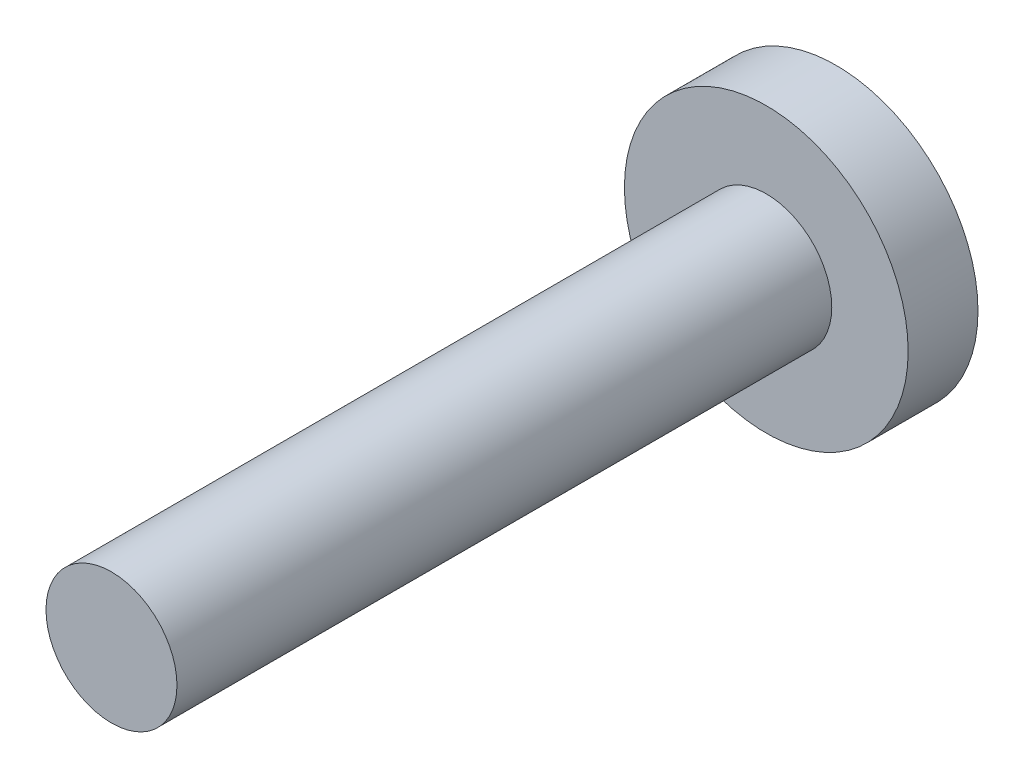
ISO-10303-21;
HEADER;
FILE_DESCRIPTION(('STEP AP214'),'2;1');
FILE_NAME('part.step','',(''),(''),'','','');
FILE_SCHEMA(('AUTOMOTIVE_DESIGN { 1 0 10303 214 1 1 1 1 }'));
ENDSEC;
DATA;
#1=APPLICATION_CONTEXT('core data for automotive mechanical design processes');
#2=APPLICATION_PROTOCOL_DEFINITION('international standard','automotive_design',2000,#1);
#3=PRODUCT_CONTEXT('',#1,'mechanical');
#4=PRODUCT('Part','Part','',(#3));
#5=PRODUCT_RELATED_PRODUCT_CATEGORY('part','',(#4));
#6=PRODUCT_DEFINITION_FORMATION('','',#4);
#7=PRODUCT_DEFINITION_CONTEXT('part definition',#1,'design');
#8=PRODUCT_DEFINITION('design','',#6,#7);
#9=PRODUCT_DEFINITION_SHAPE('','',#8);
#10=(LENGTH_UNIT() NAMED_UNIT(*) SI_UNIT(.MILLI.,.METRE.));
#11=(NAMED_UNIT(*) PLANE_ANGLE_UNIT() SI_UNIT($,.RADIAN.));
#12=(NAMED_UNIT(*) SI_UNIT($,.STERADIAN.) SOLID_ANGLE_UNIT());
#13=UNCERTAINTY_MEASURE_WITH_UNIT(LENGTH_MEASURE(1.E-05),#10,'distance_accuracy_value','');
#14=(GEOMETRIC_REPRESENTATION_CONTEXT(3) GLOBAL_UNCERTAINTY_ASSIGNED_CONTEXT((#13)) GLOBAL_UNIT_ASSIGNED_CONTEXT((#10,
#11,#12)) REPRESENTATION_CONTEXT('',''));
#15=CARTESIAN_POINT('',(0.,0.,0.));
#16=DIRECTION('',(0.,0.,1.));
#17=DIRECTION('',(1.,0.,0.));
#18=AXIS2_PLACEMENT_3D('',#15,#16,#17);
#19=CARTESIAN_POINT('',(86.6025403784436,-143.95,351.774757541019));
#20=DIRECTION('',(0.,0.,1.));
#21=DIRECTION('',(1.,0.,0.));
#22=AXIS2_PLACEMENT_3D('',#19,#20,#21);
#23=CYLINDRICAL_SURFACE('',#22,1.5);
#24=CARTESIAN_POINT('',(86.6025403784436,-143.95,350.774757541019));
#25=DIRECTION('',(0.,0.,1.));
#26=DIRECTION('',(1.,0.,0.));
#27=AXIS2_PLACEMENT_3D('',#24,#25,#26);
#28=CIRCLE('',#27,1.5);
#29=CARTESIAN_POINT('',(88.1025403784436,-143.95,350.774757541019));
#30=VERTEX_POINT('',#29);
#31=EDGE_CURVE('E136',#30,#30,#28,.T.);
#32=ORIENTED_EDGE('',*,*,#31,.T.);
#33=EDGE_LOOP('',(#32));
#34=FACE_BOUND('',#33,.T.);
#35=CARTESIAN_POINT('',(86.6025403784436,-143.95,365.774757541019));
#36=DIRECTION('',(0.,0.,-1.));
#37=DIRECTION('',(-1.,0.,0.));
#38=AXIS2_PLACEMENT_3D('',#35,#36,#37);
#39=CIRCLE('',#38,1.5);
#40=CARTESIAN_POINT('',(85.1025403784436,-143.95,365.774757541019));
#41=VERTEX_POINT('',#40);
#42=EDGE_CURVE('E11',#41,#41,#39,.T.);
#43=ORIENTED_EDGE('',*,*,#42,.T.);
#44=EDGE_LOOP('',(#43));
#45=FACE_BOUND('',#44,.T.);
#46=ADVANCED_FACE('F43',(#34,#45),#23,.T.);
#47=CARTESIAN_POINT('',(86.6025403784436,-143.95,365.774757541019));
#48=DIRECTION('',(0.,0.,-1.));
#49=DIRECTION('',(0.,-1.,0.));
#50=AXIS2_PLACEMENT_3D('',#47,#48,#49);
#51=PLANE('',#50);
#52=ORIENTED_EDGE('',*,*,#42,.F.);
#53=EDGE_LOOP('',(#52));
#54=FACE_BOUND('',#53,.T.);
#55=ADVANCED_FACE('F189',(#54),#51,.F.);
#56=CARTESIAN_POINT('',(-12.990381056767,-121.450000000002,350.424757541018));
#57=DIRECTION('',(0.,0.,-1.));
#58=DIRECTION('',(0.,-1.,0.));
#59=AXIS2_PLACEMENT_3D('',#56,#57,#58);
#60=PLANE('',#59);
#61=DIRECTION('',(0.866025403784439,0.5,0.));
#62=VECTOR('',#61,1.);
#63=CARTESIAN_POINT('',(86.4775403784435,-142.290117976081,350.424757541018));
#64=LINE('',#63,#62);
#65=CARTESIAN_POINT('',(85.1025403784435,-143.083974596217,350.424757541018));
#66=VERTEX_POINT('',#65);
#67=CARTESIAN_POINT('',(86.6025403784436,-142.217949192433,350.424757541018));
#68=VERTEX_POINT('',#67);
#69=EDGE_CURVE('E113',#66,#68,#64,.T.);
#70=ORIENTED_EDGE('',*,*,#69,.T.);
#71=DIRECTION('',(0.866025403784439,-0.5,0.));
#72=VECTOR('',#71,1.);
#73=CARTESIAN_POINT('',(87.9775403784436,-143.011805812569,350.424757541018));
#74=LINE('',#73,#72);
#75=CARTESIAN_POINT('',(88.1025403784436,-143.083974596217,350.424757541018));
#76=VERTEX_POINT('',#75);
#77=EDGE_CURVE('E53',#68,#76,#74,.T.);
#78=ORIENTED_EDGE('',*,*,#77,.T.);
#79=DIRECTION('',(0.,-1.,0.));
#80=VECTOR('',#79,1.);
#81=CARTESIAN_POINT('',(88.1025403784436,-144.671687836489,350.424757541018));
#82=LINE('',#81,#80);
#83=CARTESIAN_POINT('',(88.1025403784436,-144.816025403786,350.424757541018));
#84=VERTEX_POINT('',#83);
#85=EDGE_CURVE('E148',#76,#84,#82,.T.);
#86=ORIENTED_EDGE('',*,*,#85,.T.);
#87=DIRECTION('',(-0.866025403784439,-0.5,0.));
#88=VECTOR('',#87,1.);
#89=CARTESIAN_POINT('',(86.7275403784436,-145.609882023922,350.424757541018));
#90=LINE('',#89,#88);
#91=CARTESIAN_POINT('',(86.6025403784436,-145.682050807571,350.424757541018));
#92=VERTEX_POINT('',#91);
#93=EDGE_CURVE('E149',#84,#92,#90,.T.);
#94=ORIENTED_EDGE('',*,*,#93,.T.);
#95=DIRECTION('',(-0.866025403784439,0.5,0.));
#96=VECTOR('',#95,1.);
#97=CARTESIAN_POINT('',(85.2275403784435,-144.888194187435,350.424757541018));
#98=LINE('',#97,#96);
#99=CARTESIAN_POINT('',(85.1025403784435,-144.816025403786,350.424757541018));
#100=VERTEX_POINT('',#99);
#101=EDGE_CURVE('E93',#92,#100,#98,.T.);
#102=ORIENTED_EDGE('',*,*,#101,.T.);
#103=DIRECTION('',(0.,1.,0.));
#104=VECTOR('',#103,1.);
#105=CARTESIAN_POINT('',(85.1025403784435,-143.228312163515,350.424757541018));
#106=LINE('',#105,#104);
#107=EDGE_CURVE('E98',#100,#66,#106,.T.);
#108=ORIENTED_EDGE('',*,*,#107,.T.);
#109=EDGE_LOOP('',(#70,#78,#86,#94,#102,#108));
#110=FACE_BOUND('',#109,.T.);
#111=ADVANCED_FACE('F196',(#110),#60,.T.);
#112=CARTESIAN_POINT('',(87.9775403784436,-143.011805812569,350.674757541018));
#113=DIRECTION('',(0.5,0.866025403784439,0.));
#114=DIRECTION('',(0.,0.,-1.));
#115=AXIS2_PLACEMENT_3D('',#112,#113,#114);
#116=PLANE('',#115);
#117=DIRECTION('',(-0.866025403784439,0.5,0.));
#118=VECTOR('',#117,1.);
#119=CARTESIAN_POINT('',(87.9775403784436,-143.011805812569,349.174757541018));
#120=LINE('',#119,#118);
#121=CARTESIAN_POINT('',(88.1025403784436,-143.083974596217,349.174757541018));
#122=VERTEX_POINT('',#121);
#123=CARTESIAN_POINT('',(86.6025403784436,-142.217949192433,349.174757541018));
#124=VERTEX_POINT('',#123);
#125=EDGE_CURVE('E129',#122,#124,#120,.T.);
#126=ORIENTED_EDGE('',*,*,#125,.F.);
#127=DIRECTION('',(0.,0.,1.));
#128=VECTOR('',#127,1.);
#129=CARTESIAN_POINT('',(88.1025403784436,-143.083974596217,350.674757541018));
#130=LINE('',#129,#128);
#131=EDGE_CURVE('E153',#122,#76,#130,.T.);
#132=ORIENTED_EDGE('',*,*,#131,.T.);
#133=ORIENTED_EDGE('',*,*,#77,.F.);
#134=DIRECTION('',(0.,0.,1.));
#135=VECTOR('',#134,1.);
#136=CARTESIAN_POINT('',(86.6025403784436,-142.217949192433,350.674757541018));
#137=LINE('',#136,#135);
#138=EDGE_CURVE('E139',#124,#68,#137,.T.);
#139=ORIENTED_EDGE('',*,*,#138,.F.);
#140=EDGE_LOOP('',(#126,#132,#133,#139));
#141=FACE_BOUND('',#140,.T.);
#142=ADVANCED_FACE('F227',(#141),#116,.F.);
#143=CARTESIAN_POINT('',(88.1025403784436,-144.671687836489,350.674757541018));
#144=DIRECTION('',(1.,0.,0.));
#145=DIRECTION('',(0.,1.,0.));
#146=AXIS2_PLACEMENT_3D('',#143,#144,#145);
#147=PLANE('',#146);
#148=DIRECTION('',(0.,1.,0.));
#149=VECTOR('',#148,1.);
#150=CARTESIAN_POINT('',(88.1025403784436,-144.671687836489,349.174757541018));
#151=LINE('',#150,#149);
#152=CARTESIAN_POINT('',(88.1025403784436,-144.816025403786,349.174757541018));
#153=VERTEX_POINT('',#152);
#154=EDGE_CURVE('E150',#153,#122,#151,.T.);
#155=ORIENTED_EDGE('',*,*,#154,.F.);
#156=DIRECTION('',(0.,0.,1.));
#157=VECTOR('',#156,1.);
#158=CARTESIAN_POINT('',(88.1025403784436,-144.816025403786,350.674757541018));
#159=LINE('',#158,#157);
#160=EDGE_CURVE('E145',#153,#84,#159,.T.);
#161=ORIENTED_EDGE('',*,*,#160,.T.);
#162=ORIENTED_EDGE('',*,*,#85,.F.);
#163=ORIENTED_EDGE('',*,*,#131,.F.);
#164=EDGE_LOOP('',(#155,#161,#162,#163));
#165=FACE_BOUND('',#164,.T.);
#166=ADVANCED_FACE('F45',(#165),#147,.F.);
#167=CARTESIAN_POINT('',(86.7275403784436,-145.609882023922,350.674757541018));
#168=DIRECTION('',(0.5,-0.866025403784439,0.));
#169=DIRECTION('',(0.,0.,-1.));
#170=AXIS2_PLACEMENT_3D('',#167,#168,#169);
#171=PLANE('',#170);
#172=DIRECTION('',(0.866025403784439,0.5,0.));
#173=VECTOR('',#172,1.);
#174=CARTESIAN_POINT('',(86.7275403784436,-145.609882023922,349.174757541018));
#175=LINE('',#174,#173);
#176=CARTESIAN_POINT('',(86.6025403784436,-145.682050807571,349.174757541018));
#177=VERTEX_POINT('',#176);
#178=EDGE_CURVE('E133',#177,#153,#175,.T.);
#179=ORIENTED_EDGE('',*,*,#178,.F.);
#180=DIRECTION('',(0.,0.,1.));
#181=VECTOR('',#180,1.);
#182=CARTESIAN_POINT('',(86.6025403784436,-145.682050807571,350.674757541018));
#183=LINE('',#182,#181);
#184=EDGE_CURVE('E47',#177,#92,#183,.T.);
#185=ORIENTED_EDGE('',*,*,#184,.T.);
#186=ORIENTED_EDGE('',*,*,#93,.F.);
#187=ORIENTED_EDGE('',*,*,#160,.F.);
#188=EDGE_LOOP('',(#179,#185,#186,#187));
#189=FACE_BOUND('',#188,.T.);
#190=ADVANCED_FACE('F159',(#189),#171,.F.);
#191=CARTESIAN_POINT('',(85.2275403784435,-144.888194187435,350.674757541018));
#192=DIRECTION('',(-0.5,-0.866025403784439,0.));
#193=DIRECTION('',(-0.866025403784439,0.5,0.));
#194=AXIS2_PLACEMENT_3D('',#191,#192,#193);
#195=PLANE('',#194);
#196=DIRECTION('',(0.866025403784439,-0.5,0.));
#197=VECTOR('',#196,1.);
#198=CARTESIAN_POINT('',(85.2275403784435,-144.888194187435,349.174757541018));
#199=LINE('',#198,#197);
#200=CARTESIAN_POINT('',(85.1025403784435,-144.816025403786,349.174757541018));
#201=VERTEX_POINT('',#200);
#202=EDGE_CURVE('E123',#201,#177,#199,.T.);
#203=ORIENTED_EDGE('',*,*,#202,.F.);
#204=DIRECTION('',(0.,0.,1.));
#205=VECTOR('',#204,1.);
#206=CARTESIAN_POINT('',(85.1025403784435,-144.816025403786,350.674757541018));
#207=LINE('',#206,#205);
#208=EDGE_CURVE('E119',#201,#100,#207,.T.);
#209=ORIENTED_EDGE('',*,*,#208,.T.);
#210=ORIENTED_EDGE('',*,*,#101,.F.);
#211=ORIENTED_EDGE('',*,*,#184,.F.);
#212=EDGE_LOOP('',(#203,#209,#210,#211));
#213=FACE_BOUND('',#212,.T.);
#214=ADVANCED_FACE('F163',(#213),#195,.F.);
#215=CARTESIAN_POINT('',(85.1025403784435,-143.228312163515,350.674757541018));
#216=DIRECTION('',(-1.,0.,0.));
#217=DIRECTION('',(0.,0.,1.));
#218=AXIS2_PLACEMENT_3D('',#215,#216,#217);
#219=PLANE('',#218);
#220=DIRECTION('',(0.,-1.,0.));
#221=VECTOR('',#220,1.);
#222=CARTESIAN_POINT('',(85.1025403784435,-143.228312163515,349.174757541018));
#223=LINE('',#222,#221);
#224=CARTESIAN_POINT('',(85.1025403784435,-143.083974596217,349.174757541018));
#225=VERTEX_POINT('',#224);
#226=EDGE_CURVE('E117',#225,#201,#223,.T.);
#227=ORIENTED_EDGE('',*,*,#226,.F.);
#228=DIRECTION('',(0.,0.,1.));
#229=VECTOR('',#228,1.);
#230=CARTESIAN_POINT('',(85.1025403784435,-143.083974596217,350.674757541018));
#231=LINE('',#230,#229);
#232=EDGE_CURVE('E107',#225,#66,#231,.T.);
#233=ORIENTED_EDGE('',*,*,#232,.T.);
#234=ORIENTED_EDGE('',*,*,#107,.F.);
#235=ORIENTED_EDGE('',*,*,#208,.F.);
#236=EDGE_LOOP('',(#227,#233,#234,#235));
#237=FACE_BOUND('',#236,.T.);
#238=ADVANCED_FACE('F118',(#237),#219,.F.);
#239=CARTESIAN_POINT('',(86.4775403784435,-142.290117976081,350.674757541018));
#240=DIRECTION('',(-0.5,0.866025403784439,0.));
#241=DIRECTION('',(0.,0.,1.));
#242=AXIS2_PLACEMENT_3D('',#239,#240,#241);
#243=PLANE('',#242);
#244=DIRECTION('',(-0.866025403784439,-0.5,0.));
#245=VECTOR('',#244,1.);
#246=CARTESIAN_POINT('',(86.4775403784435,-142.290117976081,349.174757541018));
#247=LINE('',#246,#245);
#248=EDGE_CURVE('E112',#124,#225,#247,.T.);
#249=ORIENTED_EDGE('',*,*,#248,.F.);
#250=ORIENTED_EDGE('',*,*,#138,.T.);
#251=ORIENTED_EDGE('',*,*,#69,.F.);
#252=ORIENTED_EDGE('',*,*,#232,.F.);
#253=EDGE_LOOP('',(#249,#250,#251,#252));
#254=FACE_BOUND('',#253,.T.);
#255=ADVANCED_FACE('F109',(#254),#243,.F.);
#256=CARTESIAN_POINT('',(86.6025403784436,-143.95,350.774757541019));
#257=DIRECTION('',(0.,0.,-1.));
#258=DIRECTION('',(0.,-1.,0.));
#259=AXIS2_PLACEMENT_3D('',#256,#257,#258);
#260=PLANE('',#259);
#261=ORIENTED_EDGE('',*,*,#31,.F.);
#262=EDGE_LOOP('',(#261));
#263=FACE_BOUND('',#262,.T.);
#264=CARTESIAN_POINT('',(86.6025403784436,-143.95,350.774757541019));
#265=DIRECTION('',(0.,0.,-1.));
#266=DIRECTION('',(1.,0.,0.));
#267=AXIS2_PLACEMENT_3D('',#264,#265,#266);
#268=CIRCLE('',#267,3.25);
#269=CARTESIAN_POINT('',(89.8525403784436,-143.95,350.774757541019));
#270=VERTEX_POINT('',#269);
#271=EDGE_CURVE('E140',#270,#270,#268,.T.);
#272=ORIENTED_EDGE('',*,*,#271,.F.);
#273=EDGE_LOOP('',(#272));
#274=FACE_BOUND('',#273,.T.);
#275=ADVANCED_FACE('F176',(#263,#274),#260,.F.);
#276=CARTESIAN_POINT('',(86.6025403784436,-143.95,372.474757541018));
#277=DIRECTION('',(0.,0.,-1.));
#278=DIRECTION('',(1.,0.,0.));
#279=AXIS2_PLACEMENT_3D('',#276,#277,#278);
#280=CYLINDRICAL_SURFACE('',#279,3.25);
#281=ORIENTED_EDGE('',*,*,#271,.T.);
#282=EDGE_LOOP('',(#281));
#283=FACE_BOUND('',#282,.T.);
#284=CARTESIAN_POINT('',(86.6025403784436,-143.95,349.174757541018));
#285=DIRECTION('',(0.,0.,1.));
#286=DIRECTION('',(1.,0.,0.));
#287=AXIS2_PLACEMENT_3D('',#284,#285,#286);
#288=CIRCLE('',#287,3.25);
#289=CARTESIAN_POINT('',(89.8525403784436,-143.95,349.174757541018));
#290=VERTEX_POINT('',#289);
#291=EDGE_CURVE('E141',#290,#290,#288,.T.);
#292=ORIENTED_EDGE('',*,*,#291,.T.);
#293=EDGE_LOOP('',(#292));
#294=FACE_BOUND('',#293,.T.);
#295=ADVANCED_FACE('F173',(#283,#294),#280,.T.);
#296=CARTESIAN_POINT('',(86.6025403784436,-143.95,349.174757541018));
#297=DIRECTION('',(0.,0.,-1.));
#298=DIRECTION('',(0.,-1.,0.));
#299=AXIS2_PLACEMENT_3D('',#296,#297,#298);
#300=PLANE('',#299);
#301=ORIENTED_EDGE('',*,*,#291,.F.);
#302=EDGE_LOOP('',(#301));
#303=FACE_BOUND('',#302,.T.);
#304=ORIENTED_EDGE('',*,*,#248,.T.);
#305=ORIENTED_EDGE('',*,*,#226,.T.);
#306=ORIENTED_EDGE('',*,*,#202,.T.);
#307=ORIENTED_EDGE('',*,*,#178,.T.);
#308=ORIENTED_EDGE('',*,*,#154,.T.);
#309=ORIENTED_EDGE('',*,*,#125,.T.);
#310=EDGE_LOOP('',(#304,#305,#306,#307,#308,#309));
#311=FACE_BOUND('',#310,.T.);
#312=ADVANCED_FACE('F126',(#303,#311),#300,.T.);
#313=CLOSED_SHELL('',(#46,#55,#111,#142,#166,#190,#214,#238,#255,#275,#295,#312));
#314=MANIFOLD_SOLID_BREP('B2',#313);
#315=ADVANCED_BREP_SHAPE_REPRESENTATION('',(#18,#314),#14);
#316=SHAPE_DEFINITION_REPRESENTATION(#9,#315);
ENDSEC;
END-ISO-10303-21;
